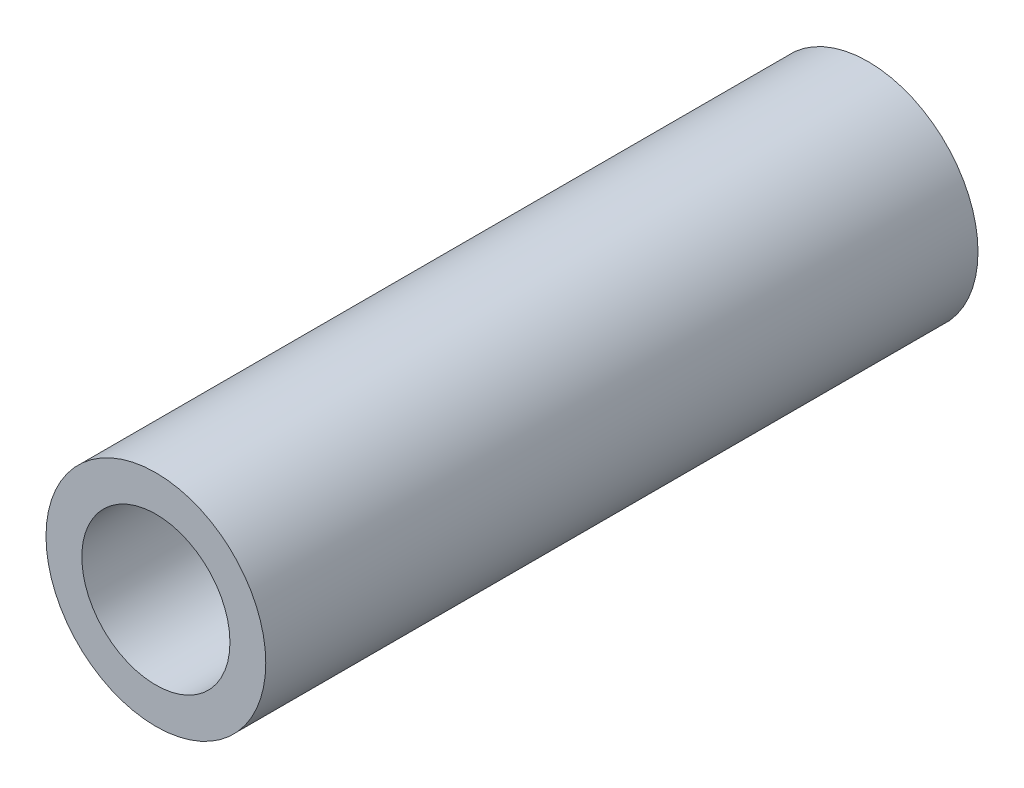
ISO-10303-21;
HEADER;
FILE_DESCRIPTION(('STEP AP214'),'2;1');
FILE_NAME('part.step','',(''),(''),'','','');
FILE_SCHEMA(('AUTOMOTIVE_DESIGN { 1 0 10303 214 1 1 1 1 }'));
ENDSEC;
DATA;
#1=APPLICATION_CONTEXT('core data for automotive mechanical design processes');
#2=APPLICATION_PROTOCOL_DEFINITION('international standard','automotive_design',2000,#1);
#3=PRODUCT_CONTEXT('',#1,'mechanical');
#4=PRODUCT('Part','Part','',(#3));
#5=PRODUCT_RELATED_PRODUCT_CATEGORY('part','',(#4));
#6=PRODUCT_DEFINITION_FORMATION('','',#4);
#7=PRODUCT_DEFINITION_CONTEXT('part definition',#1,'design');
#8=PRODUCT_DEFINITION('design','',#6,#7);
#9=PRODUCT_DEFINITION_SHAPE('','',#8);
#10=(LENGTH_UNIT() NAMED_UNIT(*) SI_UNIT(.MILLI.,.METRE.));
#11=(NAMED_UNIT(*) PLANE_ANGLE_UNIT() SI_UNIT($,.RADIAN.));
#12=(NAMED_UNIT(*) SI_UNIT($,.STERADIAN.) SOLID_ANGLE_UNIT());
#13=UNCERTAINTY_MEASURE_WITH_UNIT(LENGTH_MEASURE(1.E-05),#10,'distance_accuracy_value','');
#14=(GEOMETRIC_REPRESENTATION_CONTEXT(3) GLOBAL_UNCERTAINTY_ASSIGNED_CONTEXT((#13)) GLOBAL_UNIT_ASSIGNED_CONTEXT((#10,
#11,#12)) REPRESENTATION_CONTEXT('',''));
#15=CARTESIAN_POINT('',(0.,0.,0.));
#16=DIRECTION('',(0.,0.,1.));
#17=DIRECTION('',(1.,0.,0.));
#18=AXIS2_PLACEMENT_3D('',#15,#16,#17);
#19=CARTESIAN_POINT('',(0.,0.,22.225));
#20=DIRECTION('',(0.,0.,1.));
#21=DIRECTION('',(1.,0.,0.));
#22=AXIS2_PLACEMENT_3D('',#19,#20,#21);
#23=PLANE('',#22);
#24=CARTESIAN_POINT('',(0.,0.,22.225));
#25=DIRECTION('',(0.,0.,1.));
#26=DIRECTION('',(1.,0.,0.));
#27=AXIS2_PLACEMENT_3D('',#24,#25,#26);
#28=CIRCLE('',#27,6.858);
#29=CARTESIAN_POINT('',(6.858,0.,22.225));
#30=VERTEX_POINT('',#29);
#31=EDGE_CURVE('E10',#30,#30,#28,.T.);
#32=ORIENTED_EDGE('',*,*,#31,.T.);
#33=EDGE_LOOP('',(#32));
#34=FACE_BOUND('',#33,.T.);
#35=CARTESIAN_POINT('',(0.,0.,22.225));
#36=DIRECTION('',(0.,0.,1.));
#37=DIRECTION('',(1.,0.,0.));
#38=AXIS2_PLACEMENT_3D('',#35,#36,#37);
#39=CIRCLE('',#38,4.6228);
#40=CARTESIAN_POINT('',(4.6228,0.,22.225));
#41=VERTEX_POINT('',#40);
#42=EDGE_CURVE('E50',#41,#41,#39,.T.);
#43=ORIENTED_EDGE('',*,*,#42,.F.);
#44=EDGE_LOOP('',(#43));
#45=FACE_BOUND('',#44,.T.);
#46=ADVANCED_FACE('F39',(#34,#45),#23,.T.);
#47=CARTESIAN_POINT('',(0.,0.,-22.225));
#48=DIRECTION('',(0.,0.,1.));
#49=DIRECTION('',(1.,0.,0.));
#50=AXIS2_PLACEMENT_3D('',#47,#48,#49);
#51=PLANE('',#50);
#52=CARTESIAN_POINT('',(0.,0.,-22.225));
#53=DIRECTION('',(0.,0.,1.));
#54=DIRECTION('',(1.,0.,0.));
#55=AXIS2_PLACEMENT_3D('',#52,#53,#54);
#56=CIRCLE('',#55,6.858);
#57=CARTESIAN_POINT('',(6.858,0.,-22.225));
#58=VERTEX_POINT('',#57);
#59=EDGE_CURVE('E43',#58,#58,#56,.T.);
#60=ORIENTED_EDGE('',*,*,#59,.F.);
#61=EDGE_LOOP('',(#60));
#62=FACE_BOUND('',#61,.T.);
#63=CARTESIAN_POINT('',(0.,0.,-22.225));
#64=DIRECTION('',(0.,0.,1.));
#65=DIRECTION('',(1.,0.,0.));
#66=AXIS2_PLACEMENT_3D('',#63,#64,#65);
#67=CIRCLE('',#66,4.6228);
#68=CARTESIAN_POINT('',(4.6228,0.,-22.225));
#69=VERTEX_POINT('',#68);
#70=EDGE_CURVE('E52',#69,#69,#67,.T.);
#71=ORIENTED_EDGE('',*,*,#70,.T.);
#72=EDGE_LOOP('',(#71));
#73=FACE_BOUND('',#72,.T.);
#74=ADVANCED_FACE('F62',(#62,#73),#51,.F.);
#75=CARTESIAN_POINT('',(0.,0.,22.225));
#76=DIRECTION('',(0.,0.,-1.));
#77=DIRECTION('',(-1.,0.,0.));
#78=AXIS2_PLACEMENT_3D('',#75,#76,#77);
#79=CYLINDRICAL_SURFACE('',#78,6.858);
#80=ORIENTED_EDGE('',*,*,#31,.F.);
#81=EDGE_LOOP('',(#80));
#82=FACE_BOUND('',#81,.T.);
#83=ORIENTED_EDGE('',*,*,#59,.T.);
#84=EDGE_LOOP('',(#83));
#85=FACE_BOUND('',#84,.T.);
#86=ADVANCED_FACE('F41',(#82,#85),#79,.T.);
#87=CARTESIAN_POINT('',(0.,0.,22.225));
#88=DIRECTION('',(0.,0.,-1.));
#89=DIRECTION('',(-1.,0.,0.));
#90=AXIS2_PLACEMENT_3D('',#87,#88,#89);
#91=CYLINDRICAL_SURFACE('',#90,4.6228);
#92=ORIENTED_EDGE('',*,*,#42,.T.);
#93=EDGE_LOOP('',(#92));
#94=FACE_BOUND('',#93,.T.);
#95=ORIENTED_EDGE('',*,*,#70,.F.);
#96=EDGE_LOOP('',(#95));
#97=FACE_BOUND('',#96,.T.);
#98=ADVANCED_FACE('F58',(#94,#97),#91,.F.);
#99=CLOSED_SHELL('',(#46,#74,#86,#98));
#100=MANIFOLD_SOLID_BREP('B2',#99);
#101=ADVANCED_BREP_SHAPE_REPRESENTATION('',(#18,#100),#14);
#102=SHAPE_DEFINITION_REPRESENTATION(#9,#101);
ENDSEC;
END-ISO-10303-21;
